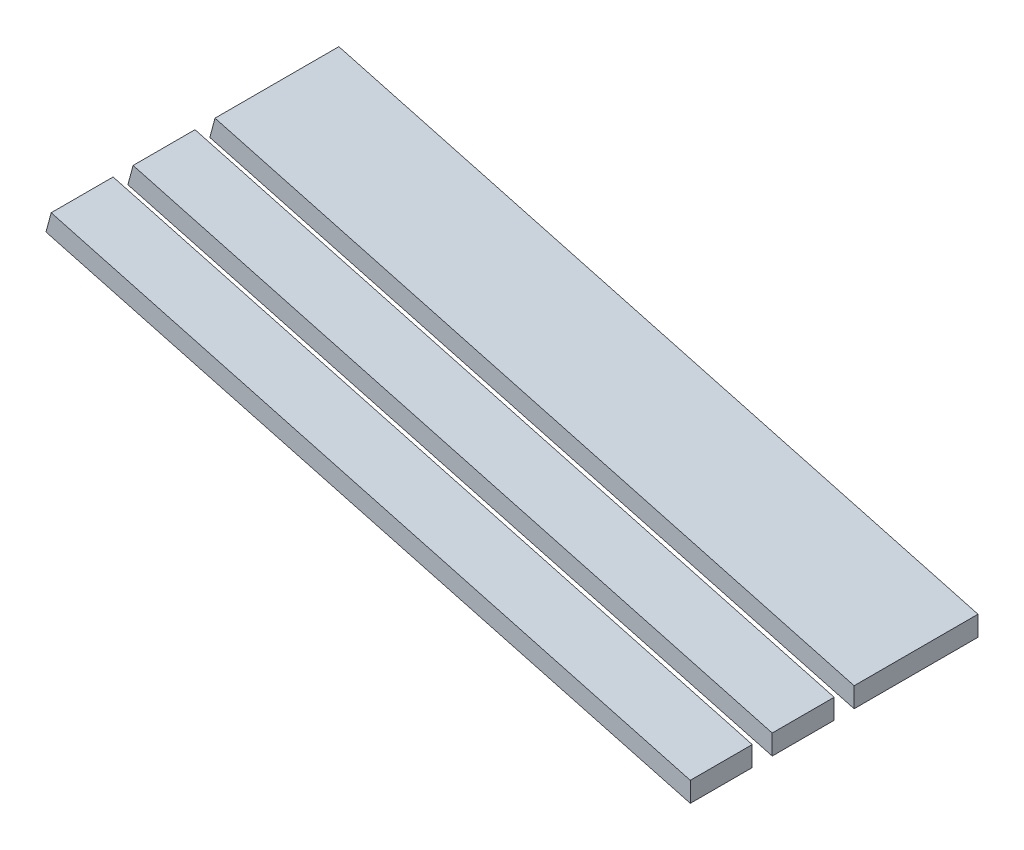
ISO-10303-21;
HEADER;
FILE_DESCRIPTION(('STEP AP214'),'2;1');
FILE_NAME('part.step','',(''),(''),'','','');
FILE_SCHEMA(('AUTOMOTIVE_DESIGN { 1 0 10303 214 1 1 1 1 }'));
ENDSEC;
DATA;
#1=APPLICATION_CONTEXT('core data for automotive mechanical design processes');
#2=APPLICATION_PROTOCOL_DEFINITION('international standard','automotive_design',2000,#1);
#3=PRODUCT_CONTEXT('',#1,'mechanical');
#4=PRODUCT('Part','Part','',(#3));
#5=PRODUCT_RELATED_PRODUCT_CATEGORY('part','',(#4));
#6=PRODUCT_DEFINITION_FORMATION('','',#4);
#7=PRODUCT_DEFINITION_CONTEXT('part definition',#1,'design');
#8=PRODUCT_DEFINITION('design','',#6,#7);
#9=PRODUCT_DEFINITION_SHAPE('','',#8);
#10=(LENGTH_UNIT() NAMED_UNIT(*) SI_UNIT(.MILLI.,.METRE.));
#11=(NAMED_UNIT(*) PLANE_ANGLE_UNIT() SI_UNIT($,.RADIAN.));
#12=(NAMED_UNIT(*) SI_UNIT($,.STERADIAN.) SOLID_ANGLE_UNIT());
#13=UNCERTAINTY_MEASURE_WITH_UNIT(LENGTH_MEASURE(1.E-05),#10,'distance_accuracy_value','');
#14=(GEOMETRIC_REPRESENTATION_CONTEXT(3) GLOBAL_UNCERTAINTY_ASSIGNED_CONTEXT((#13)) GLOBAL_UNIT_ASSIGNED_CONTEXT((#10,
#11,#12)) REPRESENTATION_CONTEXT('',''));
#15=CARTESIAN_POINT('',(0.,0.,0.));
#16=DIRECTION('',(0.,0.,1.));
#17=DIRECTION('',(1.,0.,0.));
#18=AXIS2_PLACEMENT_3D('',#15,#16,#17);
#19=CARTESIAN_POINT('',(-2150.,100.,565.));
#20=DIRECTION('',(-0.259812396329255,-0.965659111029172,0.));
#21=DIRECTION('',(0.965659111029172,-0.259812396329255,0.));
#22=AXIS2_PLACEMENT_3D('',#19,#20,#21);
#23=PLANE('',#22);
#24=DIRECTION('',(0.,0.,-1.));
#25=VECTOR('',#24,1.);
#26=CARTESIAN_POINT('',(-5349.11809548975,960.728728219254,565.));
#27=LINE('',#26,#25);
#28=CARTESIAN_POINT('',(-5349.11809548975,960.728728219254,-255.));
#29=VERTEX_POINT('',#28);
#30=CARTESIAN_POINT('',(-5349.11809548975,960.728728219254,-875.));
#31=VERTEX_POINT('',#30);
#32=EDGE_CURVE('E114',#29,#31,#27,.T.);
#33=ORIENTED_EDGE('',*,*,#32,.F.);
#34=DIRECTION('',(0.965659111029172,-0.259812396329255,0.));
#35=VECTOR('',#34,1.);
#36=CARTESIAN_POINT('',(-2150.,100.,-255.));
#37=LINE('',#36,#35);
#38=CARTESIAN_POINT('',(-2150.,100.,-255.));
#39=VERTEX_POINT('',#38);
#40=EDGE_CURVE('E65',#29,#39,#37,.T.);
#41=ORIENTED_EDGE('',*,*,#40,.T.);
#42=DIRECTION('',(0.,0.,1.));
#43=VECTOR('',#42,1.);
#44=CARTESIAN_POINT('',(-2150.,100.,-875.));
#45=LINE('',#44,#43);
#46=CARTESIAN_POINT('',(-2150.,100.,-875.));
#47=VERTEX_POINT('',#46);
#48=EDGE_CURVE('E12',#47,#39,#45,.T.);
#49=ORIENTED_EDGE('',*,*,#48,.F.);
#50=DIRECTION('',(-0.965659111029172,0.259812396329255,0.));
#51=VECTOR('',#50,1.);
#52=CARTESIAN_POINT('',(-2150.,100.,-875.));
#53=LINE('',#52,#51);
#54=EDGE_CURVE('E106',#47,#31,#53,.T.);
#55=ORIENTED_EDGE('',*,*,#54,.T.);
#56=EDGE_LOOP('',(#33,#41,#49,#55));
#57=FACE_BOUND('',#56,.T.);
#58=ADVANCED_FACE('F49',(#57),#23,.F.);
#59=CARTESIAN_POINT('',(-5375.,864.136145590347,565.));
#60=DIRECTION('',(0.965925826289067,-0.258819045102525,0.));
#61=DIRECTION('',(0.258819045102525,0.965925826289067,0.));
#62=AXIS2_PLACEMENT_3D('',#59,#60,#61);
#63=PLANE('',#62);
#64=DIRECTION('',(0.,0.,-1.));
#65=VECTOR('',#64,1.);
#66=CARTESIAN_POINT('',(-5375.,864.136145590347,565.));
#67=LINE('',#66,#65);
#68=CARTESIAN_POINT('',(-5375.,864.136145590347,-255.));
#69=VERTEX_POINT('',#68);
#70=CARTESIAN_POINT('',(-5375.,864.136145590347,-875.));
#71=VERTEX_POINT('',#70);
#72=EDGE_CURVE('E52',#69,#71,#67,.T.);
#73=ORIENTED_EDGE('',*,*,#72,.F.);
#74=DIRECTION('',(0.258819045102525,0.965925826289067,0.));
#75=VECTOR('',#74,1.);
#76=CARTESIAN_POINT('',(-5375.,864.136145590347,-255.));
#77=LINE('',#76,#75);
#78=EDGE_CURVE('E70',#69,#29,#77,.T.);
#79=ORIENTED_EDGE('',*,*,#78,.T.);
#80=ORIENTED_EDGE('',*,*,#32,.T.);
#81=DIRECTION('',(-0.258819045102525,-0.965925826289067,0.));
#82=VECTOR('',#81,1.);
#83=CARTESIAN_POINT('',(-5375.,864.136145590347,-875.));
#84=LINE('',#83,#82);
#85=EDGE_CURVE('E98',#31,#71,#84,.T.);
#86=ORIENTED_EDGE('',*,*,#85,.T.);
#87=EDGE_LOOP('',(#73,#79,#80,#86));
#88=FACE_BOUND('',#87,.T.);
#89=ADVANCED_FACE('F119',(#88),#63,.F.);
#90=CARTESIAN_POINT('',(-5375.,864.136145590347,565.));
#91=DIRECTION('',(0.258819045102514,0.96592582628907,0.));
#92=DIRECTION('',(-0.96592582628907,0.258819045102514,0.));
#93=AXIS2_PLACEMENT_3D('',#90,#91,#92);
#94=PLANE('',#93);
#95=DIRECTION('',(0.,0.,1.));
#96=VECTOR('',#95,1.);
#97=CARTESIAN_POINT('',(-2150.,0.,-875.));
#98=LINE('',#97,#96);
#99=CARTESIAN_POINT('',(-2150.,0.,-875.));
#100=VERTEX_POINT('',#99);
#101=CARTESIAN_POINT('',(-2150.,-1.11022302462516E-13,-255.));
#102=VERTEX_POINT('',#101);
#103=EDGE_CURVE('E93',#100,#102,#98,.T.);
#104=ORIENTED_EDGE('',*,*,#103,.T.);
#105=DIRECTION('',(-0.96592582628907,0.258819045102514,0.));
#106=VECTOR('',#105,1.);
#107=CARTESIAN_POINT('',(-5375.,864.136145590347,-255.));
#108=LINE('',#107,#106);
#109=EDGE_CURVE('E97',#102,#69,#108,.T.);
#110=ORIENTED_EDGE('',*,*,#109,.T.);
#111=ORIENTED_EDGE('',*,*,#72,.T.);
#112=DIRECTION('',(0.96592582628907,-0.258819045102514,0.));
#113=VECTOR('',#112,1.);
#114=CARTESIAN_POINT('',(-5375.,864.136145590347,-875.));
#115=LINE('',#114,#113);
#116=EDGE_CURVE('E57',#71,#100,#115,.T.);
#117=ORIENTED_EDGE('',*,*,#116,.T.);
#118=EDGE_LOOP('',(#104,#110,#111,#117));
#119=FACE_BOUND('',#118,.T.);
#120=ADVANCED_FACE('F108',(#119),#94,.F.);
#121=CARTESIAN_POINT('',(-2150.,100.,-875.));
#122=DIRECTION('',(0.,0.,1.));
#123=DIRECTION('',(1.,0.,0.));
#124=AXIS2_PLACEMENT_3D('',#121,#122,#123);
#125=PLANE('',#124);
#126=ORIENTED_EDGE('',*,*,#54,.F.);
#127=DIRECTION('',(0.,1.,0.));
#128=VECTOR('',#127,1.);
#129=CARTESIAN_POINT('',(-2150.,-1671.,-875.));
#130=LINE('',#129,#128);
#131=EDGE_CURVE('E85',#100,#47,#130,.T.);
#132=ORIENTED_EDGE('',*,*,#131,.F.);
#133=ORIENTED_EDGE('',*,*,#116,.F.);
#134=ORIENTED_EDGE('',*,*,#85,.F.);
#135=EDGE_LOOP('',(#126,#132,#133,#134));
#136=FACE_BOUND('',#135,.T.);
#137=ADVANCED_FACE('F103',(#136),#125,.F.);
#138=CARTESIAN_POINT('',(-2150.,100.,-255.));
#139=DIRECTION('',(0.,0.,-1.));
#140=DIRECTION('',(-1.,0.,0.));
#141=AXIS2_PLACEMENT_3D('',#138,#139,#140);
#142=PLANE('',#141);
#143=ORIENTED_EDGE('',*,*,#109,.F.);
#144=DIRECTION('',(0.,1.,0.));
#145=VECTOR('',#144,1.);
#146=CARTESIAN_POINT('',(-2150.,100.,-255.));
#147=LINE('',#146,#145);
#148=EDGE_CURVE('E89',#102,#39,#147,.T.);
#149=ORIENTED_EDGE('',*,*,#148,.T.);
#150=ORIENTED_EDGE('',*,*,#40,.F.);
#151=ORIENTED_EDGE('',*,*,#78,.F.);
#152=EDGE_LOOP('',(#143,#149,#150,#151));
#153=FACE_BOUND('',#152,.T.);
#154=ADVANCED_FACE('F131',(#153),#142,.F.);
#155=CARTESIAN_POINT('',(-2150.,-1671.,-875.));
#156=DIRECTION('',(-1.,0.,0.));
#157=DIRECTION('',(0.,0.,1.));
#158=AXIS2_PLACEMENT_3D('',#155,#156,#157);
#159=PLANE('',#158);
#160=ORIENTED_EDGE('',*,*,#103,.F.);
#161=ORIENTED_EDGE('',*,*,#131,.T.);
#162=ORIENTED_EDGE('',*,*,#48,.T.);
#163=ORIENTED_EDGE('',*,*,#148,.F.);
#164=EDGE_LOOP('',(#160,#161,#162,#163));
#165=FACE_BOUND('',#164,.T.);
#166=ADVANCED_FACE('F94',(#165),#159,.F.);
#167=CLOSED_SHELL('',(#58,#89,#120,#137,#154,#166));
#168=MANIFOLD_SOLID_BREP('B2',#167);
#169=CARTESIAN_POINT('',(0.,0.,565.));
#170=DIRECTION('',(0.,0.,1.));
#171=DIRECTION('',(1.,0.,0.));
#172=AXIS2_PLACEMENT_3D('',#169,#170,#171);
#173=PLANE('',#172);
#174=DIRECTION('',(0.,1.,0.));
#175=VECTOR('',#174,1.);
#176=CARTESIAN_POINT('',(-2150.,-1671.,565.));
#177=LINE('',#176,#175);
#178=CARTESIAN_POINT('',(-2150.,0.,565.));
#179=VERTEX_POINT('',#178);
#180=CARTESIAN_POINT('',(-2150.,100.,565.));
#181=VERTEX_POINT('',#180);
#182=EDGE_CURVE('E240',#179,#181,#177,.T.);
#183=ORIENTED_EDGE('',*,*,#182,.T.);
#184=DIRECTION('',(-0.965659111029172,0.259812396329255,0.));
#185=VECTOR('',#184,1.);
#186=CARTESIAN_POINT('',(-2150.,100.,565.));
#187=LINE('',#186,#185);
#188=CARTESIAN_POINT('',(-5349.11809548975,960.728728219254,565.));
#189=VERTEX_POINT('',#188);
#190=EDGE_CURVE('E248',#181,#189,#187,.T.);
#191=ORIENTED_EDGE('',*,*,#190,.T.);
#192=DIRECTION('',(-0.258819045102525,-0.965925826289067,0.));
#193=VECTOR('',#192,1.);
#194=CARTESIAN_POINT('',(-5375.,864.136145590347,565.));
#195=LINE('',#194,#193);
#196=CARTESIAN_POINT('',(-5375.,864.136145590347,565.));
#197=VERTEX_POINT('',#196);
#198=EDGE_CURVE('E257',#189,#197,#195,.T.);
#199=ORIENTED_EDGE('',*,*,#198,.T.);
#200=DIRECTION('',(0.96592582628907,-0.258819045102514,0.));
#201=VECTOR('',#200,1.);
#202=CARTESIAN_POINT('',(-5375.,864.136145590347,565.));
#203=LINE('',#202,#201);
#204=EDGE_CURVE('E251',#197,#179,#203,.T.);
#205=ORIENTED_EDGE('',*,*,#204,.T.);
#206=EDGE_LOOP('',(#183,#191,#199,#205));
#207=FACE_BOUND('',#206,.T.);
#208=ADVANCED_FACE('F199',(#207),#173,.T.);
#209=CARTESIAN_POINT('',(-5375.,864.136145590347,565.));
#210=DIRECTION('',(0.258819045102514,0.96592582628907,0.));
#211=DIRECTION('',(-0.96592582628907,0.258819045102514,0.));
#212=AXIS2_PLACEMENT_3D('',#209,#210,#211);
#213=PLANE('',#212);
#214=DIRECTION('',(0.,0.,-1.));
#215=VECTOR('',#214,1.);
#216=CARTESIAN_POINT('',(-5375.,864.136145590347,565.));
#217=LINE('',#216,#215);
#218=CARTESIAN_POINT('',(-5375.,864.136145590347,255.000000000001));
#219=VERTEX_POINT('',#218);
#220=EDGE_CURVE('E203',#197,#219,#217,.T.);
#221=ORIENTED_EDGE('',*,*,#220,.T.);
#222=DIRECTION('',(0.96592582628907,-0.258819045102514,0.));
#223=VECTOR('',#222,1.);
#224=CARTESIAN_POINT('',(-5375.,864.136145590347,255.000000000001));
#225=LINE('',#224,#223);
#226=CARTESIAN_POINT('',(-2150.,0.,255.));
#227=VERTEX_POINT('',#226);
#228=EDGE_CURVE('E263',#219,#227,#225,.T.);
#229=ORIENTED_EDGE('',*,*,#228,.T.);
#230=DIRECTION('',(0.,0.,-1.));
#231=VECTOR('',#230,1.);
#232=CARTESIAN_POINT('',(-2150.,0.,565.));
#233=LINE('',#232,#231);
#234=EDGE_CURVE('E47',#179,#227,#233,.T.);
#235=ORIENTED_EDGE('',*,*,#234,.F.);
#236=ORIENTED_EDGE('',*,*,#204,.F.);
#237=EDGE_LOOP('',(#221,#229,#235,#236));
#238=FACE_BOUND('',#237,.T.);
#239=ADVANCED_FACE('F271',(#238),#213,.F.);
#240=CARTESIAN_POINT('',(-5375.,864.136145590347,565.));
#241=DIRECTION('',(0.965925826289067,-0.258819045102525,0.));
#242=DIRECTION('',(0.258819045102525,0.965925826289067,0.));
#243=AXIS2_PLACEMENT_3D('',#240,#241,#242);
#244=PLANE('',#243);
#245=DIRECTION('',(0.,0.,-1.));
#246=VECTOR('',#245,1.);
#247=CARTESIAN_POINT('',(-5349.11809548975,960.728728219254,565.));
#248=LINE('',#247,#246);
#249=CARTESIAN_POINT('',(-5349.11809548975,960.728728219254,255.000000000001));
#250=VERTEX_POINT('',#249);
#251=EDGE_CURVE('E255',#189,#250,#248,.T.);
#252=ORIENTED_EDGE('',*,*,#251,.T.);
#253=DIRECTION('',(-0.258819045102525,-0.965925826289067,0.));
#254=VECTOR('',#253,1.);
#255=CARTESIAN_POINT('',(-5375.,864.136145590347,255.000000000001));
#256=LINE('',#255,#254);
#257=EDGE_CURVE('E217',#250,#219,#256,.T.);
#258=ORIENTED_EDGE('',*,*,#257,.T.);
#259=ORIENTED_EDGE('',*,*,#220,.F.);
#260=ORIENTED_EDGE('',*,*,#198,.F.);
#261=EDGE_LOOP('',(#252,#258,#259,#260));
#262=FACE_BOUND('',#261,.T.);
#263=ADVANCED_FACE('F273',(#262),#244,.F.);
#264=CARTESIAN_POINT('',(-2150.,100.,565.));
#265=DIRECTION('',(-0.259812396329255,-0.965659111029172,0.));
#266=DIRECTION('',(0.965659111029172,-0.259812396329255,0.));
#267=AXIS2_PLACEMENT_3D('',#264,#265,#266);
#268=PLANE('',#267);
#269=DIRECTION('',(0.,0.,-1.));
#270=VECTOR('',#269,1.);
#271=CARTESIAN_POINT('',(-2150.,100.,565.));
#272=LINE('',#271,#270);
#273=CARTESIAN_POINT('',(-2150.,100.,255.));
#274=VERTEX_POINT('',#273);
#275=EDGE_CURVE('E237',#181,#274,#272,.T.);
#276=ORIENTED_EDGE('',*,*,#275,.T.);
#277=DIRECTION('',(-0.965659111029172,0.259812396329255,0.));
#278=VECTOR('',#277,1.);
#279=CARTESIAN_POINT('',(-2150.,100.,255.));
#280=LINE('',#279,#278);
#281=EDGE_CURVE('E209',#274,#250,#280,.T.);
#282=ORIENTED_EDGE('',*,*,#281,.T.);
#283=ORIENTED_EDGE('',*,*,#251,.F.);
#284=ORIENTED_EDGE('',*,*,#190,.F.);
#285=EDGE_LOOP('',(#276,#282,#283,#284));
#286=FACE_BOUND('',#285,.T.);
#287=ADVANCED_FACE('F201',(#286),#268,.F.);
#288=CARTESIAN_POINT('',(-2150.,100.,255.));
#289=DIRECTION('',(0.,0.,1.));
#290=DIRECTION('',(1.,0.,0.));
#291=AXIS2_PLACEMENT_3D('',#288,#289,#290);
#292=PLANE('',#291);
#293=ORIENTED_EDGE('',*,*,#281,.F.);
#294=DIRECTION('',(0.,-1.,0.));
#295=VECTOR('',#294,1.);
#296=CARTESIAN_POINT('',(-2150.,100.,255.));
#297=LINE('',#296,#295);
#298=EDGE_CURVE('E243',#274,#227,#297,.T.);
#299=ORIENTED_EDGE('',*,*,#298,.T.);
#300=ORIENTED_EDGE('',*,*,#228,.F.);
#301=ORIENTED_EDGE('',*,*,#257,.F.);
#302=EDGE_LOOP('',(#293,#299,#300,#301));
#303=FACE_BOUND('',#302,.T.);
#304=ADVANCED_FACE('F270',(#303),#292,.F.);
#305=CARTESIAN_POINT('',(-2150.,-1671.,-875.));
#306=DIRECTION('',(-1.,0.,0.));
#307=DIRECTION('',(0.,0.,1.));
#308=AXIS2_PLACEMENT_3D('',#305,#306,#307);
#309=PLANE('',#308);
#310=ORIENTED_EDGE('',*,*,#298,.F.);
#311=ORIENTED_EDGE('',*,*,#275,.F.);
#312=ORIENTED_EDGE('',*,*,#182,.F.);
#313=ORIENTED_EDGE('',*,*,#234,.T.);
#314=EDGE_LOOP('',(#310,#311,#312,#313));
#315=FACE_BOUND('',#314,.T.);
#316=ADVANCED_FACE('F239',(#315),#309,.F.);
#317=CLOSED_SHELL('',(#208,#239,#263,#287,#304,#316));
#318=MANIFOLD_SOLID_BREP('B6',#317);
#319=CARTESIAN_POINT('',(-2150.,100.,-155.));
#320=DIRECTION('',(0.,0.,1.));
#321=DIRECTION('',(1.,0.,0.));
#322=AXIS2_PLACEMENT_3D('',#319,#320,#321);
#323=PLANE('',#322);
#324=DIRECTION('',(-0.965659111029172,0.259812396329255,0.));
#325=VECTOR('',#324,1.);
#326=CARTESIAN_POINT('',(-2150.,100.,-155.));
#327=LINE('',#326,#325);
#328=CARTESIAN_POINT('',(-2150.,100.,-155.));
#329=VERTEX_POINT('',#328);
#330=CARTESIAN_POINT('',(-5349.11809548975,960.728728219254,-155.));
#331=VERTEX_POINT('',#330);
#332=EDGE_CURVE('E386',#329,#331,#327,.T.);
#333=ORIENTED_EDGE('',*,*,#332,.F.);
#334=DIRECTION('',(0.,-1.,0.));
#335=VECTOR('',#334,1.);
#336=CARTESIAN_POINT('',(-2150.,100.,-155.));
#337=LINE('',#336,#335);
#338=CARTESIAN_POINT('',(-2150.,-1.11022302462516E-13,-155.));
#339=VERTEX_POINT('',#338);
#340=EDGE_CURVE('E377',#329,#339,#337,.T.);
#341=ORIENTED_EDGE('',*,*,#340,.T.);
#342=DIRECTION('',(0.96592582628907,-0.258819045102514,0.));
#343=VECTOR('',#342,1.);
#344=CARTESIAN_POINT('',(-5375.,864.136145590347,-155.));
#345=LINE('',#344,#343);
#346=CARTESIAN_POINT('',(-5375.,864.136145590347,-155.));
#347=VERTEX_POINT('',#346);
#348=EDGE_CURVE('E197',#347,#339,#345,.T.);
#349=ORIENTED_EDGE('',*,*,#348,.F.);
#350=DIRECTION('',(-0.258819045102525,-0.965925826289067,0.));
#351=VECTOR('',#350,1.);
#352=CARTESIAN_POINT('',(-5375.,864.136145590347,-155.));
#353=LINE('',#352,#351);
#354=EDGE_CURVE('E357',#331,#347,#353,.T.);
#355=ORIENTED_EDGE('',*,*,#354,.F.);
#356=EDGE_LOOP('',(#333,#341,#349,#355));
#357=FACE_BOUND('',#356,.T.);
#358=ADVANCED_FACE('F340',(#357),#323,.F.);
#359=CARTESIAN_POINT('',(-5375.,864.136145590347,565.));
#360=DIRECTION('',(0.258819045102514,0.96592582628907,0.));
#361=DIRECTION('',(-0.96592582628907,0.258819045102514,0.));
#362=AXIS2_PLACEMENT_3D('',#359,#360,#361);
#363=PLANE('',#362);
#364=DIRECTION('',(0.,0.,-1.));
#365=VECTOR('',#364,1.);
#366=CARTESIAN_POINT('',(-5375.,864.136145590347,565.));
#367=LINE('',#366,#365);
#368=CARTESIAN_POINT('',(-5375.,864.136145590347,155.));
#369=VERTEX_POINT('',#368);
#370=EDGE_CURVE('E393',#369,#347,#367,.T.);
#371=ORIENTED_EDGE('',*,*,#370,.T.);
#372=ORIENTED_EDGE('',*,*,#348,.T.);
#373=DIRECTION('',(0.,0.,1.));
#374=VECTOR('',#373,1.);
#375=CARTESIAN_POINT('',(-2150.,0.,-155.));
#376=LINE('',#375,#374);
#377=CARTESIAN_POINT('',(-2150.,-1.11022302462516E-13,155.));
#378=VERTEX_POINT('',#377);
#379=EDGE_CURVE('E383',#339,#378,#376,.T.);
#380=ORIENTED_EDGE('',*,*,#379,.T.);
#381=DIRECTION('',(-0.96592582628907,0.258819045102514,0.));
#382=VECTOR('',#381,1.);
#383=CARTESIAN_POINT('',(-5375.,864.136145590347,155.));
#384=LINE('',#383,#382);
#385=EDGE_CURVE('E348',#378,#369,#384,.T.);
#386=ORIENTED_EDGE('',*,*,#385,.T.);
#387=EDGE_LOOP('',(#371,#372,#380,#386));
#388=FACE_BOUND('',#387,.T.);
#389=ADVANCED_FACE('F405',(#388),#363,.F.);
#390=CARTESIAN_POINT('',(-5375.,864.136145590347,565.));
#391=DIRECTION('',(0.965925826289067,-0.258819045102525,0.));
#392=DIRECTION('',(0.258819045102525,0.965925826289067,0.));
#393=AXIS2_PLACEMENT_3D('',#390,#391,#392);
#394=PLANE('',#393);
#395=DIRECTION('',(0.,0.,-1.));
#396=VECTOR('',#395,1.);
#397=CARTESIAN_POINT('',(-5349.11809548975,960.728728219254,565.));
#398=LINE('',#397,#396);
#399=CARTESIAN_POINT('',(-5349.11809548975,960.728728219254,155.));
#400=VERTEX_POINT('',#399);
#401=EDGE_CURVE('E396',#400,#331,#398,.T.);
#402=ORIENTED_EDGE('',*,*,#401,.T.);
#403=ORIENTED_EDGE('',*,*,#354,.T.);
#404=ORIENTED_EDGE('',*,*,#370,.F.);
#405=DIRECTION('',(0.258819045102525,0.965925826289067,0.));
#406=VECTOR('',#405,1.);
#407=CARTESIAN_POINT('',(-5375.,864.136145590347,155.));
#408=LINE('',#407,#406);
#409=EDGE_CURVE('E410',#369,#400,#408,.T.);
#410=ORIENTED_EDGE('',*,*,#409,.T.);
#411=EDGE_LOOP('',(#402,#403,#404,#410));
#412=FACE_BOUND('',#411,.T.);
#413=ADVANCED_FACE('F409',(#412),#394,.F.);
#414=CARTESIAN_POINT('',(-2150.,100.,565.));
#415=DIRECTION('',(-0.259812396329255,-0.965659111029172,0.));
#416=DIRECTION('',(0.965659111029172,-0.259812396329255,0.));
#417=AXIS2_PLACEMENT_3D('',#414,#415,#416);
#418=PLANE('',#417);
#419=DIRECTION('',(0.,0.,1.));
#420=VECTOR('',#419,1.);
#421=CARTESIAN_POINT('',(-2150.,100.,-155.));
#422=LINE('',#421,#420);
#423=CARTESIAN_POINT('',(-2150.,100.,155.));
#424=VERTEX_POINT('',#423);
#425=EDGE_CURVE('E380',#329,#424,#422,.T.);
#426=ORIENTED_EDGE('',*,*,#425,.F.);
#427=ORIENTED_EDGE('',*,*,#332,.T.);
#428=ORIENTED_EDGE('',*,*,#401,.F.);
#429=DIRECTION('',(0.965659111029172,-0.259812396329255,0.));
#430=VECTOR('',#429,1.);
#431=CARTESIAN_POINT('',(-2150.,100.,155.));
#432=LINE('',#431,#430);
#433=EDGE_CURVE('E392',#400,#424,#432,.T.);
#434=ORIENTED_EDGE('',*,*,#433,.T.);
#435=EDGE_LOOP('',(#426,#427,#428,#434));
#436=FACE_BOUND('',#435,.T.);
#437=ADVANCED_FACE('F342',(#436),#418,.F.);
#438=CARTESIAN_POINT('',(-2150.,100.,155.));
#439=DIRECTION('',(0.,0.,-1.));
#440=DIRECTION('',(-1.,0.,0.));
#441=AXIS2_PLACEMENT_3D('',#438,#439,#440);
#442=PLANE('',#441);
#443=ORIENTED_EDGE('',*,*,#385,.F.);
#444=DIRECTION('',(0.,1.,0.));
#445=VECTOR('',#444,1.);
#446=CARTESIAN_POINT('',(-2150.,100.,155.));
#447=LINE('',#446,#445);
#448=EDGE_CURVE('E384',#378,#424,#447,.T.);
#449=ORIENTED_EDGE('',*,*,#448,.T.);
#450=ORIENTED_EDGE('',*,*,#433,.F.);
#451=ORIENTED_EDGE('',*,*,#409,.F.);
#452=EDGE_LOOP('',(#443,#449,#450,#451));
#453=FACE_BOUND('',#452,.T.);
#454=ADVANCED_FACE('F414',(#453),#442,.F.);
#455=CARTESIAN_POINT('',(-2150.,-1671.,-875.));
#456=DIRECTION('',(-1.,0.,0.));
#457=DIRECTION('',(0.,0.,1.));
#458=AXIS2_PLACEMENT_3D('',#455,#456,#457);
#459=PLANE('',#458);
#460=ORIENTED_EDGE('',*,*,#379,.F.);
#461=ORIENTED_EDGE('',*,*,#340,.F.);
#462=ORIENTED_EDGE('',*,*,#425,.T.);
#463=ORIENTED_EDGE('',*,*,#448,.F.);
#464=EDGE_LOOP('',(#460,#461,#462,#463));
#465=FACE_BOUND('',#464,.T.);
#466=ADVANCED_FACE('F378',(#465),#459,.F.);
#467=CLOSED_SHELL('',(#358,#389,#413,#437,#454,#466));
#468=MANIFOLD_SOLID_BREP('B41',#467);
#469=ADVANCED_BREP_SHAPE_REPRESENTATION('',(#18,#168,#318,#468),#14);
#470=SHAPE_DEFINITION_REPRESENTATION(#9,#469);
ENDSEC;
END-ISO-10303-21;
